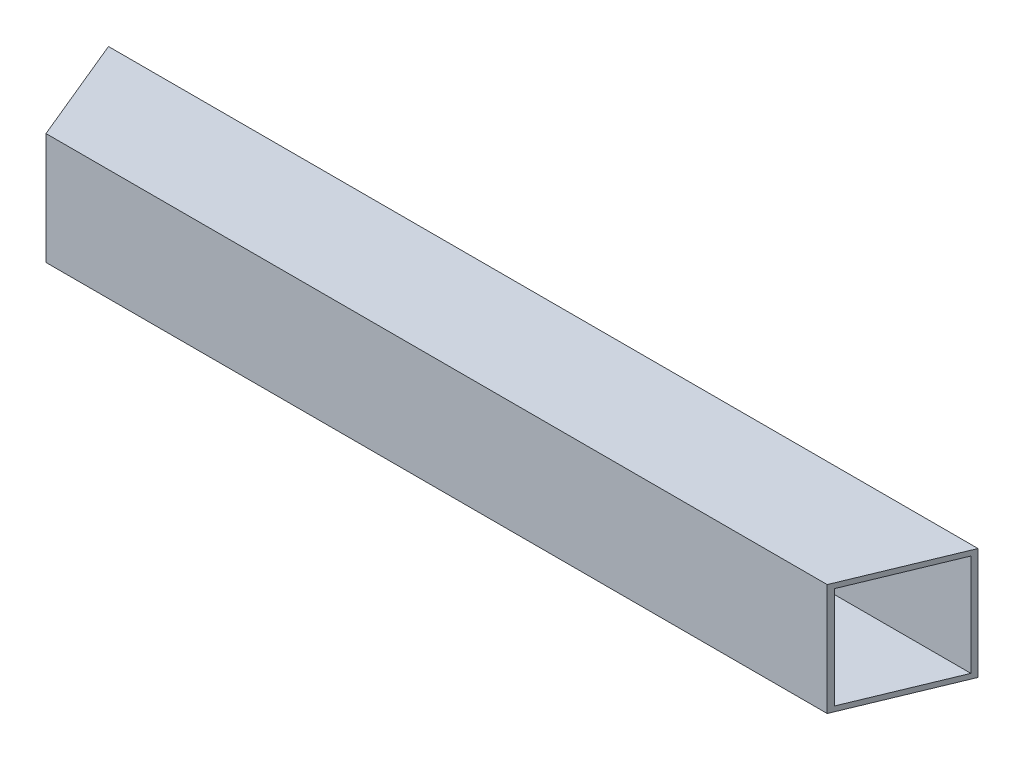
ISO-10303-21;
HEADER;
FILE_DESCRIPTION(('STEP AP214'),'2;1');
FILE_NAME('part.step','',(''),(''),'','','');
FILE_SCHEMA(('AUTOMOTIVE_DESIGN { 1 0 10303 214 1 1 1 1 }'));
ENDSEC;
DATA;
#1=APPLICATION_CONTEXT('core data for automotive mechanical design processes');
#2=APPLICATION_PROTOCOL_DEFINITION('international standard','automotive_design',2000,#1);
#3=PRODUCT_CONTEXT('',#1,'mechanical');
#4=PRODUCT('Part','Part','',(#3));
#5=PRODUCT_RELATED_PRODUCT_CATEGORY('part','',(#4));
#6=PRODUCT_DEFINITION_FORMATION('','',#4);
#7=PRODUCT_DEFINITION_CONTEXT('part definition',#1,'design');
#8=PRODUCT_DEFINITION('design','',#6,#7);
#9=PRODUCT_DEFINITION_SHAPE('','',#8);
#10=(LENGTH_UNIT() NAMED_UNIT(*) SI_UNIT(.MILLI.,.METRE.));
#11=(NAMED_UNIT(*) PLANE_ANGLE_UNIT() SI_UNIT($,.RADIAN.));
#12=(NAMED_UNIT(*) SI_UNIT($,.STERADIAN.) SOLID_ANGLE_UNIT());
#13=UNCERTAINTY_MEASURE_WITH_UNIT(LENGTH_MEASURE(1.E-05),#10,'distance_accuracy_value','');
#14=(GEOMETRIC_REPRESENTATION_CONTEXT(3) GLOBAL_UNCERTAINTY_ASSIGNED_CONTEXT((#13)) GLOBAL_UNIT_ASSIGNED_CONTEXT((#10,
#11,#12)) REPRESENTATION_CONTEXT('',''));
#15=CARTESIAN_POINT('',(0.,0.,0.));
#16=DIRECTION('',(0.,0.,1.));
#17=DIRECTION('',(1.,0.,0.));
#18=AXIS2_PLACEMENT_3D('',#15,#16,#17);
#19=CARTESIAN_POINT('',(0.,1.2,0.));
#20=DIRECTION('',(0.,-1.,0.));
#21=DIRECTION('',(0.,0.,-1.));
#22=AXIS2_PLACEMENT_3D('',#19,#20,#21);
#23=PLANE('',#22);
#24=DIRECTION('',(1.,0.,0.));
#25=VECTOR('',#24,1.);
#26=CARTESIAN_POINT('',(103.056334318426,1.2,-248.8));
#27=LINE('',#26,#25);
#28=CARTESIAN_POINT('',(-103.056334318426,1.2,-248.8));
#29=VERTEX_POINT('',#28);
#30=CARTESIAN_POINT('',(103.056334318426,1.2,-248.8));
#31=VERTEX_POINT('',#30);
#32=EDGE_CURVE('E106',#29,#31,#27,.T.);
#33=ORIENTED_EDGE('',*,*,#32,.F.);
#34=DIRECTION('',(0.382683432365094,0.,0.923879532511285));
#35=VECTOR('',#34,1.);
#36=CARTESIAN_POINT('',(-103.553390593274,1.2,-250.));
#37=LINE('',#36,#35);
#38=CARTESIAN_POINT('',(-93.5294223838448,1.2,-225.8));
#39=VERTEX_POINT('',#38);
#40=EDGE_CURVE('E146',#29,#39,#37,.T.);
#41=ORIENTED_EDGE('',*,*,#40,.T.);
#42=DIRECTION('',(-1.,0.,0.));
#43=VECTOR('',#42,1.);
#44=CARTESIAN_POINT('',(-93.5294223838448,1.2,-225.8));
#45=LINE('',#44,#43);
#46=CARTESIAN_POINT('',(93.5294223838448,1.2,-225.8));
#47=VERTEX_POINT('',#46);
#48=EDGE_CURVE('E56',#47,#39,#45,.T.);
#49=ORIENTED_EDGE('',*,*,#48,.F.);
#50=DIRECTION('',(0.38268343236509,0.,-0.923879532511287));
#51=VECTOR('',#50,1.);
#52=CARTESIAN_POINT('',(93.0323661089972,1.2,-224.6));
#53=LINE('',#52,#51);
#54=EDGE_CURVE('E51',#47,#31,#53,.T.);
#55=ORIENTED_EDGE('',*,*,#54,.T.);
#56=EDGE_LOOP('',(#33,#41,#49,#55));
#57=FACE_BOUND('',#56,.T.);
#58=ADVANCED_FACE('F36',(#57),#23,.F.);
#59=CARTESIAN_POINT('',(0.,25.4,0.));
#60=DIRECTION('',(0.,1.,0.));
#61=DIRECTION('',(0.,0.,1.));
#62=AXIS2_PLACEMENT_3D('',#59,#60,#61);
#63=PLANE('',#62);
#64=DIRECTION('',(1.,0.,0.));
#65=VECTOR('',#64,1.);
#66=CARTESIAN_POINT('',(103.056334318426,25.4,-248.8));
#67=LINE('',#66,#65);
#68=CARTESIAN_POINT('',(-103.056334318426,25.4,-248.8));
#69=VERTEX_POINT('',#68);
#70=CARTESIAN_POINT('',(103.056334318426,25.4,-248.8));
#71=VERTEX_POINT('',#70);
#72=EDGE_CURVE('E104',#69,#71,#67,.T.);
#73=ORIENTED_EDGE('',*,*,#72,.T.);
#74=DIRECTION('',(0.38268343236509,0.,-0.923879532511287));
#75=VECTOR('',#74,1.);
#76=CARTESIAN_POINT('',(93.0323661089972,25.4,-224.6));
#77=LINE('',#76,#75);
#78=CARTESIAN_POINT('',(93.5294223838448,25.4,-225.8));
#79=VERTEX_POINT('',#78);
#80=EDGE_CURVE('E116',#79,#71,#77,.T.);
#81=ORIENTED_EDGE('',*,*,#80,.F.);
#82=DIRECTION('',(-1.,0.,0.));
#83=VECTOR('',#82,1.);
#84=CARTESIAN_POINT('',(-93.5294223838448,25.4,-225.8));
#85=LINE('',#84,#83);
#86=CARTESIAN_POINT('',(-93.5294223838448,25.4,-225.8));
#87=VERTEX_POINT('',#86);
#88=EDGE_CURVE('E139',#79,#87,#85,.T.);
#89=ORIENTED_EDGE('',*,*,#88,.T.);
#90=DIRECTION('',(0.382683432365094,0.,0.923879532511285));
#91=VECTOR('',#90,1.);
#92=CARTESIAN_POINT('',(-103.553390593274,25.4,-250.));
#93=LINE('',#92,#91);
#94=EDGE_CURVE('E117',#69,#87,#93,.T.);
#95=ORIENTED_EDGE('',*,*,#94,.F.);
#96=EDGE_LOOP('',(#73,#81,#89,#95));
#97=FACE_BOUND('',#96,.T.);
#98=ADVANCED_FACE('F114',(#97),#63,.F.);
#99=CARTESIAN_POINT('',(93.0323661089972,1.2,-224.6));
#100=DIRECTION('',(-0.923879532511287,0.,-0.38268343236509));
#101=DIRECTION('',(-0.38268343236509,0.,0.923879532511287));
#102=AXIS2_PLACEMENT_3D('',#99,#100,#101);
#103=PLANE('',#102);
#104=DIRECTION('',(0.,-1.,0.));
#105=VECTOR('',#104,1.);
#106=CARTESIAN_POINT('',(103.553390593274,1.2,-250.));
#107=LINE('',#106,#105);
#108=CARTESIAN_POINT('',(103.553390593274,26.6,-250.));
#109=VERTEX_POINT('',#108);
#110=CARTESIAN_POINT('',(103.553390593274,0.,-250.));
#111=VERTEX_POINT('',#110);
#112=EDGE_CURVE('E11',#109,#111,#107,.T.);
#113=ORIENTED_EDGE('',*,*,#112,.F.);
#114=DIRECTION('',(0.38268343236509,0.,-0.923879532511287));
#115=VECTOR('',#114,1.);
#116=CARTESIAN_POINT('',(93.0323661089972,26.6,-224.6));
#117=LINE('',#116,#115);
#118=CARTESIAN_POINT('',(93.0323661089972,26.6,-224.6));
#119=VERTEX_POINT('',#118);
#120=EDGE_CURVE('E132',#119,#109,#117,.T.);
#121=ORIENTED_EDGE('',*,*,#120,.F.);
#122=DIRECTION('',(0.,-1.,0.));
#123=VECTOR('',#122,1.);
#124=CARTESIAN_POINT('',(93.0323661089972,1.2,-224.6));
#125=LINE('',#124,#123);
#126=CARTESIAN_POINT('',(93.0323661089972,0.,-224.6));
#127=VERTEX_POINT('',#126);
#128=EDGE_CURVE('E149',#119,#127,#125,.T.);
#129=ORIENTED_EDGE('',*,*,#128,.T.);
#130=DIRECTION('',(0.38268343236509,0.,-0.923879532511287));
#131=VECTOR('',#130,1.);
#132=CARTESIAN_POINT('',(93.0323661089972,0.,-224.6));
#133=LINE('',#132,#131);
#134=EDGE_CURVE('E141',#127,#111,#133,.T.);
#135=ORIENTED_EDGE('',*,*,#134,.T.);
#136=EDGE_LOOP('',(#113,#121,#129,#135));
#137=FACE_BOUND('',#136,.T.);
#138=DIRECTION('',(0.,-1.,0.));
#139=VECTOR('',#138,1.);
#140=CARTESIAN_POINT('',(103.056334318426,232.5102576249,-248.8));
#141=LINE('',#140,#139);
#142=EDGE_CURVE('E100',#71,#31,#141,.T.);
#143=ORIENTED_EDGE('',*,*,#142,.T.);
#144=ORIENTED_EDGE('',*,*,#54,.F.);
#145=DIRECTION('',(0.,-1.,0.));
#146=VECTOR('',#145,1.);
#147=CARTESIAN_POINT('',(93.5294223838448,232.5102576249,-225.8));
#148=LINE('',#147,#146);
#149=EDGE_CURVE('E121',#79,#47,#148,.T.);
#150=ORIENTED_EDGE('',*,*,#149,.F.);
#151=ORIENTED_EDGE('',*,*,#80,.T.);
#152=EDGE_LOOP('',(#143,#144,#150,#151));
#153=FACE_BOUND('',#152,.T.);
#154=ADVANCED_FACE('F38',(#137,#153),#103,.F.);
#155=CARTESIAN_POINT('',(-103.553390593274,1.2,-250.));
#156=DIRECTION('',(0.,0.,1.));
#157=DIRECTION('',(1.,0.,0.));
#158=AXIS2_PLACEMENT_3D('',#155,#156,#157);
#159=PLANE('',#158);
#160=DIRECTION('',(-1.,0.,0.));
#161=VECTOR('',#160,1.);
#162=CARTESIAN_POINT('',(-103.553390593274,0.,-250.));
#163=LINE('',#162,#161);
#164=CARTESIAN_POINT('',(-103.553390593274,0.,-250.));
#165=VERTEX_POINT('',#164);
#166=EDGE_CURVE('E152',#111,#165,#163,.T.);
#167=ORIENTED_EDGE('',*,*,#166,.T.);
#168=DIRECTION('',(0.,-1.,0.));
#169=VECTOR('',#168,1.);
#170=CARTESIAN_POINT('',(-103.553390593274,1.2,-250.));
#171=LINE('',#170,#169);
#172=CARTESIAN_POINT('',(-103.553390593274,26.6,-250.));
#173=VERTEX_POINT('',#172);
#174=EDGE_CURVE('E44',#173,#165,#171,.T.);
#175=ORIENTED_EDGE('',*,*,#174,.F.);
#176=DIRECTION('',(-1.,0.,0.));
#177=VECTOR('',#176,1.);
#178=CARTESIAN_POINT('',(103.553390593274,26.6,-250.));
#179=LINE('',#178,#177);
#180=EDGE_CURVE('E126',#109,#173,#179,.T.);
#181=ORIENTED_EDGE('',*,*,#180,.F.);
#182=ORIENTED_EDGE('',*,*,#112,.T.);
#183=EDGE_LOOP('',(#167,#175,#181,#182));
#184=FACE_BOUND('',#183,.T.);
#185=ADVANCED_FACE('F179',(#184),#159,.F.);
#186=CARTESIAN_POINT('',(-103.553390593274,1.2,-250.));
#187=DIRECTION('',(0.923879532511285,0.,-0.382683432365094));
#188=DIRECTION('',(-0.382683432365094,0.,-0.923879532511285));
#189=AXIS2_PLACEMENT_3D('',#186,#187,#188);
#190=PLANE('',#189);
#191=ORIENTED_EDGE('',*,*,#40,.F.);
#192=DIRECTION('',(0.,-1.,0.));
#193=VECTOR('',#192,1.);
#194=CARTESIAN_POINT('',(-103.056334318426,232.5102576249,-248.8));
#195=LINE('',#194,#193);
#196=EDGE_CURVE('E110',#69,#29,#195,.T.);
#197=ORIENTED_EDGE('',*,*,#196,.F.);
#198=ORIENTED_EDGE('',*,*,#94,.T.);
#199=DIRECTION('',(0.,-1.,0.));
#200=VECTOR('',#199,1.);
#201=CARTESIAN_POINT('',(-93.5294223838448,232.5102576249,-225.8));
#202=LINE('',#201,#200);
#203=EDGE_CURVE('E138',#87,#39,#202,.T.);
#204=ORIENTED_EDGE('',*,*,#203,.T.);
#205=EDGE_LOOP('',(#191,#197,#198,#204));
#206=FACE_BOUND('',#205,.T.);
#207=DIRECTION('',(0.382683432365094,0.,0.923879532511285));
#208=VECTOR('',#207,1.);
#209=CARTESIAN_POINT('',(-103.553390593274,0.,-250.));
#210=LINE('',#209,#208);
#211=CARTESIAN_POINT('',(-93.0323661089971,0.,-224.6));
#212=VERTEX_POINT('',#211);
#213=EDGE_CURVE('E154',#165,#212,#210,.T.);
#214=ORIENTED_EDGE('',*,*,#213,.T.);
#215=DIRECTION('',(0.,-1.,0.));
#216=VECTOR('',#215,1.);
#217=CARTESIAN_POINT('',(-93.0323661089971,1.2,-224.6));
#218=LINE('',#217,#216);
#219=CARTESIAN_POINT('',(-93.0323661089971,26.6,-224.6));
#220=VERTEX_POINT('',#219);
#221=EDGE_CURVE('E159',#220,#212,#218,.T.);
#222=ORIENTED_EDGE('',*,*,#221,.F.);
#223=DIRECTION('',(0.382683432365094,0.,0.923879532511285));
#224=VECTOR('',#223,1.);
#225=CARTESIAN_POINT('',(-103.553390593274,26.6,-250.));
#226=LINE('',#225,#224);
#227=EDGE_CURVE('E122',#173,#220,#226,.T.);
#228=ORIENTED_EDGE('',*,*,#227,.F.);
#229=ORIENTED_EDGE('',*,*,#174,.T.);
#230=EDGE_LOOP('',(#214,#222,#228,#229));
#231=FACE_BOUND('',#230,.T.);
#232=ADVANCED_FACE('F165',(#206,#231),#190,.F.);
#233=CARTESIAN_POINT('',(-93.0323661089971,1.2,-224.6));
#234=DIRECTION('',(0.,0.,-1.));
#235=DIRECTION('',(-1.,0.,0.));
#236=AXIS2_PLACEMENT_3D('',#233,#234,#235);
#237=PLANE('',#236);
#238=DIRECTION('',(1.,0.,0.));
#239=VECTOR('',#238,1.);
#240=CARTESIAN_POINT('',(-93.0323661089971,0.,-224.6));
#241=LINE('',#240,#239);
#242=EDGE_CURVE('E147',#212,#127,#241,.T.);
#243=ORIENTED_EDGE('',*,*,#242,.T.);
#244=ORIENTED_EDGE('',*,*,#128,.F.);
#245=DIRECTION('',(1.,0.,0.));
#246=VECTOR('',#245,1.);
#247=CARTESIAN_POINT('',(-93.0323661089971,26.6,-224.6));
#248=LINE('',#247,#246);
#249=EDGE_CURVE('E109',#220,#119,#248,.T.);
#250=ORIENTED_EDGE('',*,*,#249,.F.);
#251=ORIENTED_EDGE('',*,*,#221,.T.);
#252=EDGE_LOOP('',(#243,#244,#250,#251));
#253=FACE_BOUND('',#252,.T.);
#254=ADVANCED_FACE('F173',(#253),#237,.F.);
#255=CARTESIAN_POINT('',(0.,0.,0.));
#256=DIRECTION('',(0.,-1.,0.));
#257=DIRECTION('',(0.,0.,-1.));
#258=AXIS2_PLACEMENT_3D('',#255,#256,#257);
#259=PLANE('',#258);
#260=ORIENTED_EDGE('',*,*,#134,.F.);
#261=ORIENTED_EDGE('',*,*,#242,.F.);
#262=ORIENTED_EDGE('',*,*,#213,.F.);
#263=ORIENTED_EDGE('',*,*,#166,.F.);
#264=EDGE_LOOP('',(#260,#261,#262,#263));
#265=FACE_BOUND('',#264,.T.);
#266=ADVANCED_FACE('F171',(#265),#259,.T.);
#267=CARTESIAN_POINT('',(-93.5294223838448,232.5102576249,-225.8));
#268=DIRECTION('',(0.,0.,1.));
#269=DIRECTION('',(1.,0.,0.));
#270=AXIS2_PLACEMENT_3D('',#267,#268,#269);
#271=PLANE('',#270);
#272=ORIENTED_EDGE('',*,*,#88,.F.);
#273=ORIENTED_EDGE('',*,*,#149,.T.);
#274=ORIENTED_EDGE('',*,*,#48,.T.);
#275=ORIENTED_EDGE('',*,*,#203,.F.);
#276=EDGE_LOOP('',(#272,#273,#274,#275));
#277=FACE_BOUND('',#276,.T.);
#278=ADVANCED_FACE('F195',(#277),#271,.F.);
#279=CARTESIAN_POINT('',(0.,26.6,0.));
#280=DIRECTION('',(0.,1.,0.));
#281=DIRECTION('',(0.,0.,1.));
#282=AXIS2_PLACEMENT_3D('',#279,#280,#281);
#283=PLANE('',#282);
#284=ORIENTED_EDGE('',*,*,#249,.T.);
#285=ORIENTED_EDGE('',*,*,#120,.T.);
#286=ORIENTED_EDGE('',*,*,#180,.T.);
#287=ORIENTED_EDGE('',*,*,#227,.T.);
#288=EDGE_LOOP('',(#284,#285,#286,#287));
#289=FACE_BOUND('',#288,.T.);
#290=ADVANCED_FACE('F178',(#289),#283,.T.);
#291=CARTESIAN_POINT('',(103.056334318426,232.5102576249,-248.8));
#292=DIRECTION('',(0.,0.,-1.));
#293=DIRECTION('',(-1.,0.,0.));
#294=AXIS2_PLACEMENT_3D('',#291,#292,#293);
#295=PLANE('',#294);
#296=ORIENTED_EDGE('',*,*,#72,.F.);
#297=ORIENTED_EDGE('',*,*,#196,.T.);
#298=ORIENTED_EDGE('',*,*,#32,.T.);
#299=ORIENTED_EDGE('',*,*,#142,.F.);
#300=EDGE_LOOP('',(#296,#297,#298,#299));
#301=FACE_BOUND('',#300,.T.);
#302=ADVANCED_FACE('F102',(#301),#295,.F.);
#303=CLOSED_SHELL('',(#58,#98,#154,#185,#232,#254,#266,#278,#290,#302));
#304=MANIFOLD_SOLID_BREP('B2',#303);
#305=ADVANCED_BREP_SHAPE_REPRESENTATION('',(#18,#304),#14);
#306=SHAPE_DEFINITION_REPRESENTATION(#9,#305);
ENDSEC;
END-ISO-10303-21;
